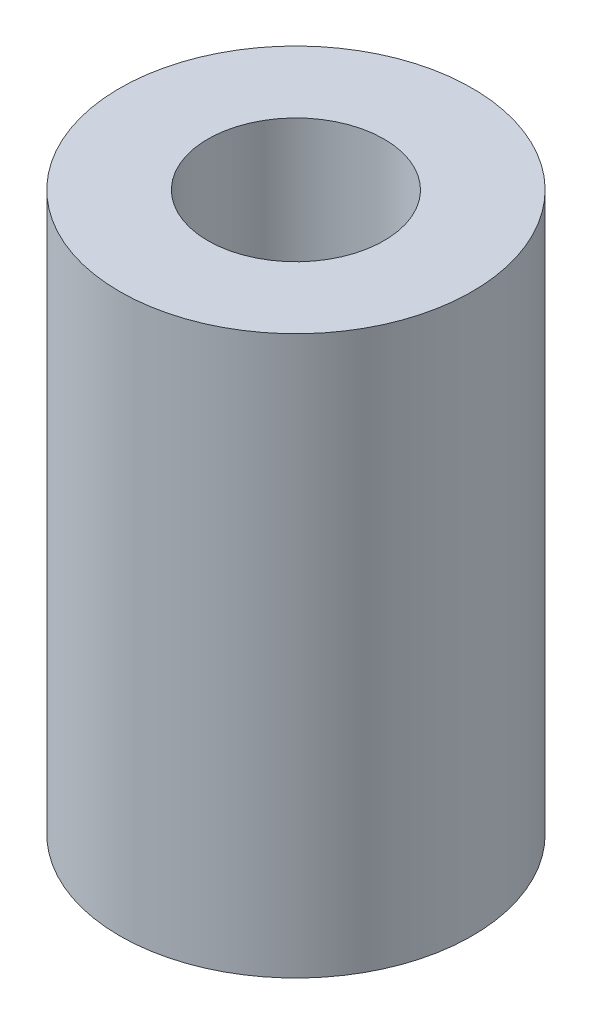
ISO-10303-21;
HEADER;
FILE_DESCRIPTION(('STEP AP214'),'2;1');
FILE_NAME('part.step','',(''),(''),'','','');
FILE_SCHEMA(('AUTOMOTIVE_DESIGN { 1 0 10303 214 1 1 1 1 }'));
ENDSEC;
DATA;
#1=APPLICATION_CONTEXT('core data for automotive mechanical design processes');
#2=APPLICATION_PROTOCOL_DEFINITION('international standard','automotive_design',2000,#1);
#3=PRODUCT_CONTEXT('',#1,'mechanical');
#4=PRODUCT('Part','Part','',(#3));
#5=PRODUCT_RELATED_PRODUCT_CATEGORY('part','',(#4));
#6=PRODUCT_DEFINITION_FORMATION('','',#4);
#7=PRODUCT_DEFINITION_CONTEXT('part definition',#1,'design');
#8=PRODUCT_DEFINITION('design','',#6,#7);
#9=PRODUCT_DEFINITION_SHAPE('','',#8);
#10=(LENGTH_UNIT() NAMED_UNIT(*) SI_UNIT(.MILLI.,.METRE.));
#11=(NAMED_UNIT(*) PLANE_ANGLE_UNIT() SI_UNIT($,.RADIAN.));
#12=(NAMED_UNIT(*) SI_UNIT($,.STERADIAN.) SOLID_ANGLE_UNIT());
#13=UNCERTAINTY_MEASURE_WITH_UNIT(LENGTH_MEASURE(1.E-05),#10,'distance_accuracy_value','');
#14=(GEOMETRIC_REPRESENTATION_CONTEXT(3) GLOBAL_UNCERTAINTY_ASSIGNED_CONTEXT((#13)) GLOBAL_UNIT_ASSIGNED_CONTEXT((#10,
#11,#12)) REPRESENTATION_CONTEXT('',''));
#15=CARTESIAN_POINT('',(0.,0.,0.));
#16=DIRECTION('',(0.,0.,1.));
#17=DIRECTION('',(1.,0.,0.));
#18=AXIS2_PLACEMENT_3D('',#15,#16,#17);
#19=CARTESIAN_POINT('',(0.,19.,0.));
#20=DIRECTION('',(0.,1.,0.));
#21=DIRECTION('',(0.,0.,1.));
#22=AXIS2_PLACEMENT_3D('',#19,#20,#21);
#23=PLANE('',#22);
#24=CARTESIAN_POINT('',(0.,19.,0.));
#25=DIRECTION('',(0.,1.,0.));
#26=DIRECTION('',(0.,0.,1.));
#27=AXIS2_PLACEMENT_3D('',#24,#25,#26);
#28=CIRCLE('',#27,6.);
#29=CARTESIAN_POINT('',(0.,19.,6.));
#30=VERTEX_POINT('',#29);
#31=EDGE_CURVE('E10',#30,#30,#28,.T.);
#32=ORIENTED_EDGE('',*,*,#31,.T.);
#33=EDGE_LOOP('',(#32));
#34=FACE_BOUND('',#33,.T.);
#35=CARTESIAN_POINT('',(0.,19.,0.));
#36=DIRECTION('',(0.,1.,0.));
#37=DIRECTION('',(0.,0.,1.));
#38=AXIS2_PLACEMENT_3D('',#35,#36,#37);
#39=CIRCLE('',#38,3.);
#40=CARTESIAN_POINT('',(0.,19.,3.));
#41=VERTEX_POINT('',#40);
#42=EDGE_CURVE('E56',#41,#41,#39,.T.);
#43=ORIENTED_EDGE('',*,*,#42,.F.);
#44=EDGE_LOOP('',(#43));
#45=FACE_BOUND('',#44,.T.);
#46=ADVANCED_FACE('F43',(#34,#45),#23,.T.);
#47=CARTESIAN_POINT('',(0.,0.,0.));
#48=DIRECTION('',(0.,1.,0.));
#49=DIRECTION('',(0.,0.,1.));
#50=AXIS2_PLACEMENT_3D('',#47,#48,#49);
#51=PLANE('',#50);
#52=CARTESIAN_POINT('',(0.,0.,0.));
#53=DIRECTION('',(0.,1.,0.));
#54=DIRECTION('',(0.,0.,1.));
#55=AXIS2_PLACEMENT_3D('',#52,#53,#54);
#56=CIRCLE('',#55,6.);
#57=CARTESIAN_POINT('',(0.,0.,6.));
#58=VERTEX_POINT('',#57);
#59=EDGE_CURVE('E47',#58,#58,#56,.T.);
#60=ORIENTED_EDGE('',*,*,#59,.F.);
#61=EDGE_LOOP('',(#60));
#62=FACE_BOUND('',#61,.T.);
#63=CARTESIAN_POINT('',(0.,0.,0.));
#64=DIRECTION('',(0.,1.,0.));
#65=DIRECTION('',(0.,0.,1.));
#66=AXIS2_PLACEMENT_3D('',#63,#64,#65);
#67=CIRCLE('',#66,3.);
#68=CARTESIAN_POINT('',(0.,0.,3.));
#69=VERTEX_POINT('',#68);
#70=EDGE_CURVE('E58',#69,#69,#67,.T.);
#71=ORIENTED_EDGE('',*,*,#70,.T.);
#72=EDGE_LOOP('',(#71));
#73=FACE_BOUND('',#72,.T.);
#74=ADVANCED_FACE('F70',(#62,#73),#51,.F.);
#75=CARTESIAN_POINT('',(0.,19.,0.));
#76=DIRECTION('',(0.,-1.,0.));
#77=DIRECTION('',(0.,0.,-1.));
#78=AXIS2_PLACEMENT_3D('',#75,#76,#77);
#79=CYLINDRICAL_SURFACE('',#78,6.);
#80=ORIENTED_EDGE('',*,*,#31,.F.);
#81=EDGE_LOOP('',(#80));
#82=FACE_BOUND('',#81,.T.);
#83=ORIENTED_EDGE('',*,*,#59,.T.);
#84=EDGE_LOOP('',(#83));
#85=FACE_BOUND('',#84,.T.);
#86=ADVANCED_FACE('F45',(#82,#85),#79,.T.);
#87=CARTESIAN_POINT('',(0.,19.,0.));
#88=DIRECTION('',(0.,-1.,0.));
#89=DIRECTION('',(0.,0.,-1.));
#90=AXIS2_PLACEMENT_3D('',#87,#88,#89);
#91=CYLINDRICAL_SURFACE('',#90,3.);
#92=ORIENTED_EDGE('',*,*,#42,.T.);
#93=EDGE_LOOP('',(#92));
#94=FACE_BOUND('',#93,.T.);
#95=ORIENTED_EDGE('',*,*,#70,.F.);
#96=EDGE_LOOP('',(#95));
#97=FACE_BOUND('',#96,.T.);
#98=ADVANCED_FACE('F66',(#94,#97),#91,.F.);
#99=CLOSED_SHELL('',(#46,#74,#86,#98));
#100=MANIFOLD_SOLID_BREP('B2',#99);
#101=ADVANCED_BREP_SHAPE_REPRESENTATION('',(#18,#100),#14);
#102=SHAPE_DEFINITION_REPRESENTATION(#9,#101);
ENDSEC;
END-ISO-10303-21;
